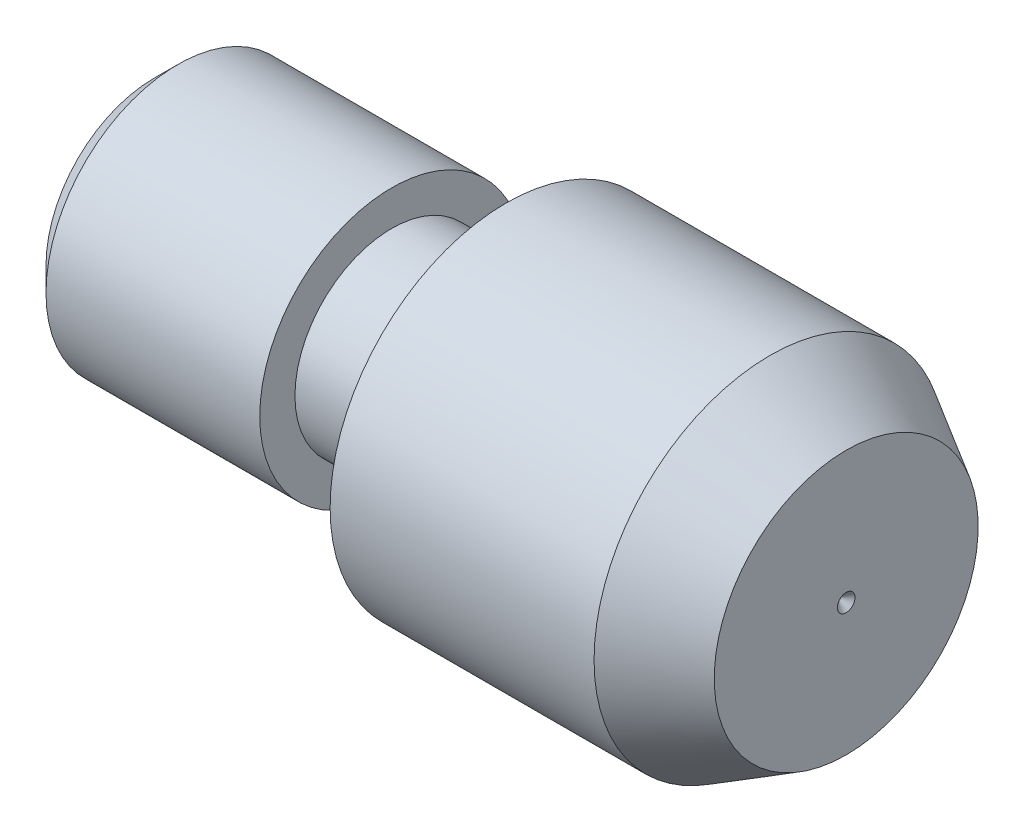
ISO-10303-21;
HEADER;
FILE_DESCRIPTION(('STEP AP214'),'2;1');
FILE_NAME('part.step','',(''),(''),'','','');
FILE_SCHEMA(('AUTOMOTIVE_DESIGN { 1 0 10303 214 1 1 1 1 }'));
ENDSEC;
DATA;
#1=APPLICATION_CONTEXT('core data for automotive mechanical design processes');
#2=APPLICATION_PROTOCOL_DEFINITION('international standard','automotive_design',2000,#1);
#3=PRODUCT_CONTEXT('',#1,'mechanical');
#4=PRODUCT('Part','Part','',(#3));
#5=PRODUCT_RELATED_PRODUCT_CATEGORY('part','',(#4));
#6=PRODUCT_DEFINITION_FORMATION('','',#4);
#7=PRODUCT_DEFINITION_CONTEXT('part definition',#1,'design');
#8=PRODUCT_DEFINITION('design','',#6,#7);
#9=PRODUCT_DEFINITION_SHAPE('','',#8);
#10=(LENGTH_UNIT() NAMED_UNIT(*) SI_UNIT(.MILLI.,.METRE.));
#11=(NAMED_UNIT(*) PLANE_ANGLE_UNIT() SI_UNIT($,.RADIAN.));
#12=(NAMED_UNIT(*) SI_UNIT($,.STERADIAN.) SOLID_ANGLE_UNIT());
#13=UNCERTAINTY_MEASURE_WITH_UNIT(LENGTH_MEASURE(1.E-05),#10,'distance_accuracy_value','');
#14=(GEOMETRIC_REPRESENTATION_CONTEXT(3) GLOBAL_UNCERTAINTY_ASSIGNED_CONTEXT((#13)) GLOBAL_UNIT_ASSIGNED_CONTEXT((#10,
#11,#12)) REPRESENTATION_CONTEXT('',''));
#15=CARTESIAN_POINT('',(0.,0.,0.));
#16=DIRECTION('',(0.,0.,1.));
#17=DIRECTION('',(1.,0.,0.));
#18=AXIS2_PLACEMENT_3D('',#15,#16,#17);
#19=CARTESIAN_POINT('',(7.86602540378444,0.,0.));
#20=DIRECTION('',(-1.,0.,0.));
#21=DIRECTION('',(0.,-1.,0.));
#22=AXIS2_PLACEMENT_3D('',#19,#20,#21);
#23=PLANE('',#22);
#24=CARTESIAN_POINT('',(7.86602540378444,0.,0.));
#25=DIRECTION('',(-1.,0.,0.));
#26=DIRECTION('',(0.,-1.,0.));
#27=AXIS2_PLACEMENT_3D('',#24,#25,#26);
#28=CIRCLE('',#27,1.5);
#29=CARTESIAN_POINT('',(7.86602540378444,-1.5,0.));
#30=VERTEX_POINT('',#29);
#31=EDGE_CURVE('E55',#30,#30,#28,.T.);
#32=ORIENTED_EDGE('',*,*,#31,.F.);
#33=EDGE_LOOP('',(#32));
#34=FACE_BOUND('',#33,.T.);
#35=CARTESIAN_POINT('',(7.86602540378444,0.,0.));
#36=DIRECTION('',(-1.,0.,0.));
#37=DIRECTION('',(0.,-1.,0.));
#38=AXIS2_PLACEMENT_3D('',#35,#36,#37);
#39=CIRCLE('',#38,0.1);
#40=CARTESIAN_POINT('',(7.86602540378444,-0.100000000000001,0.));
#41=VERTEX_POINT('',#40);
#42=EDGE_CURVE('E53',#41,#41,#39,.T.);
#43=ORIENTED_EDGE('',*,*,#42,.T.);
#44=EDGE_LOOP('',(#43));
#45=FACE_BOUND('',#44,.T.);
#46=ADVANCED_FACE('F36',(#34,#45),#23,.F.);
#47=CARTESIAN_POINT('',(3.8,0.,0.));
#48=DIRECTION('',(-1.,0.,0.));
#49=DIRECTION('',(0.,0.,1.));
#50=AXIS2_PLACEMENT_3D('',#47,#48,#49);
#51=TOROIDAL_SURFACE('',#50,1.3,0.2);
#52=CARTESIAN_POINT('',(3.8,0.,0.));
#53=DIRECTION('',(-1.,0.,0.));
#54=DIRECTION('',(0.,0.,1.));
#55=AXIS2_PLACEMENT_3D('',#52,#53,#54);
#56=CIRCLE('',#55,1.1);
#57=CARTESIAN_POINT('',(3.8,0.,1.1));
#58=VERTEX_POINT('',#57);
#59=EDGE_CURVE('E75',#58,#58,#56,.T.);
#60=ORIENTED_EDGE('',*,*,#59,.F.);
#61=EDGE_LOOP('',(#60));
#62=FACE_BOUND('',#61,.T.);
#63=CARTESIAN_POINT('',(4.,0.,0.));
#64=DIRECTION('',(-1.,0.,0.));
#65=DIRECTION('',(0.,0.,1.));
#66=AXIS2_PLACEMENT_3D('',#63,#64,#65);
#67=CIRCLE('',#66,1.3);
#68=CARTESIAN_POINT('',(4.,0.,1.3));
#69=VERTEX_POINT('',#68);
#70=EDGE_CURVE('E63',#69,#69,#67,.T.);
#71=ORIENTED_EDGE('',*,*,#70,.T.);
#72=EDGE_LOOP('',(#71));
#73=FACE_BOUND('',#72,.T.);
#74=ADVANCED_FACE('F96',(#62,#73),#51,.F.);
#75=CARTESIAN_POINT('',(0.,0.,0.));
#76=DIRECTION('',(-1.,0.,0.));
#77=DIRECTION('',(0.,0.,1.));
#78=AXIS2_PLACEMENT_3D('',#75,#76,#77);
#79=CYLINDRICAL_SURFACE('',#78,1.1);
#80=CARTESIAN_POINT('',(2.7,0.,0.));
#81=DIRECTION('',(-1.,0.,0.));
#82=DIRECTION('',(0.,0.,1.));
#83=AXIS2_PLACEMENT_3D('',#80,#81,#82);
#84=CIRCLE('',#83,1.1);
#85=CARTESIAN_POINT('',(2.7,0.,1.1));
#86=VERTEX_POINT('',#85);
#87=EDGE_CURVE('E72',#86,#86,#84,.T.);
#88=ORIENTED_EDGE('',*,*,#87,.F.);
#89=EDGE_LOOP('',(#88));
#90=FACE_BOUND('',#89,.T.);
#91=ORIENTED_EDGE('',*,*,#59,.T.);
#92=EDGE_LOOP('',(#91));
#93=FACE_BOUND('',#92,.T.);
#94=ADVANCED_FACE('F102',(#90,#93),#79,.T.);
#95=CARTESIAN_POINT('',(2.7,1.5,0.));
#96=DIRECTION('',(-1.,0.,0.));
#97=DIRECTION('',(0.,0.,1.));
#98=AXIS2_PLACEMENT_3D('',#95,#96,#97);
#99=PLANE('',#98);
#100=CARTESIAN_POINT('',(2.7,0.,0.));
#101=DIRECTION('',(-1.,0.,0.));
#102=DIRECTION('',(0.,0.,1.));
#103=AXIS2_PLACEMENT_3D('',#100,#101,#102);
#104=CIRCLE('',#103,1.5);
#105=CARTESIAN_POINT('',(2.7,0.,1.5));
#106=VERTEX_POINT('',#105);
#107=EDGE_CURVE('E69',#106,#106,#104,.T.);
#108=ORIENTED_EDGE('',*,*,#107,.F.);
#109=EDGE_LOOP('',(#108));
#110=FACE_BOUND('',#109,.T.);
#111=ORIENTED_EDGE('',*,*,#87,.T.);
#112=EDGE_LOOP('',(#111));
#113=FACE_BOUND('',#112,.T.);
#114=ADVANCED_FACE('F114',(#110,#113),#99,.F.);
#115=CARTESIAN_POINT('',(0.,0.,0.));
#116=DIRECTION('',(-1.,0.,0.));
#117=DIRECTION('',(0.,0.,1.));
#118=AXIS2_PLACEMENT_3D('',#115,#116,#117);
#119=CYLINDRICAL_SURFACE('',#118,1.5);
#120=CARTESIAN_POINT('',(0.270499999999998,0.,0.));
#121=DIRECTION('',(1.,0.,0.));
#122=DIRECTION('',(0.,0.,-1.));
#123=AXIS2_PLACEMENT_3D('',#120,#121,#122);
#124=CIRCLE('',#123,1.5);
#125=CARTESIAN_POINT('',(0.270499999999998,0.,-1.5));
#126=VERTEX_POINT('',#125);
#127=EDGE_CURVE('E11',#126,#126,#124,.T.);
#128=ORIENTED_EDGE('',*,*,#127,.T.);
#129=EDGE_LOOP('',(#128));
#130=FACE_BOUND('',#129,.T.);
#131=ORIENTED_EDGE('',*,*,#107,.T.);
#132=EDGE_LOOP('',(#131));
#133=FACE_BOUND('',#132,.T.);
#134=ADVANCED_FACE('F111',(#130,#133),#119,.T.);
#135=CARTESIAN_POINT('',(0.,0.,0.));
#136=DIRECTION('',(1.,0.,0.));
#137=DIRECTION('',(0.,0.,-1.));
#138=AXIS2_PLACEMENT_3D('',#135,#136,#137);
#139=PLANE('',#138);
#140=CARTESIAN_POINT('',(0.,0.,0.));
#141=DIRECTION('',(1.,0.,0.));
#142=DIRECTION('',(0.,0.,-1.));
#143=AXIS2_PLACEMENT_3D('',#140,#141,#142);
#144=CIRCLE('',#143,1.2295);
#145=CARTESIAN_POINT('',(0.,0.,-1.2295));
#146=VERTEX_POINT('',#145);
#147=EDGE_CURVE('E43',#146,#146,#144,.F.);
#148=ORIENTED_EDGE('',*,*,#147,.T.);
#149=EDGE_LOOP('',(#148));
#150=FACE_BOUND('',#149,.T.);
#151=ADVANCED_FACE('F80',(#150),#139,.F.);
#152=CARTESIAN_POINT('',(0.,0.,0.));
#153=DIRECTION('',(-1.,0.,0.));
#154=DIRECTION('',(0.,0.,1.));
#155=AXIS2_PLACEMENT_3D('',#152,#153,#154);
#156=CYLINDRICAL_SURFACE('',#155,2.);
#157=CARTESIAN_POINT('',(4.,0.,0.));
#158=DIRECTION('',(-1.,0.,0.));
#159=DIRECTION('',(0.,0.,1.));
#160=AXIS2_PLACEMENT_3D('',#157,#158,#159);
#161=CIRCLE('',#160,2.);
#162=CARTESIAN_POINT('',(4.,0.,2.));
#163=VERTEX_POINT('',#162);
#164=EDGE_CURVE('E66',#163,#163,#161,.T.);
#165=ORIENTED_EDGE('',*,*,#164,.F.);
#166=EDGE_LOOP('',(#165));
#167=FACE_BOUND('',#166,.T.);
#168=CARTESIAN_POINT('',(7.,0.,0.));
#169=DIRECTION('',(-1.,0.,0.));
#170=DIRECTION('',(0.,-1.,0.));
#171=AXIS2_PLACEMENT_3D('',#168,#169,#170);
#172=CIRCLE('',#171,2.);
#173=CARTESIAN_POINT('',(7.,-2.,0.));
#174=VERTEX_POINT('',#173);
#175=EDGE_CURVE('E58',#174,#174,#172,.T.);
#176=ORIENTED_EDGE('',*,*,#175,.T.);
#177=EDGE_LOOP('',(#176));
#178=FACE_BOUND('',#177,.T.);
#179=ADVANCED_FACE('F91',(#167,#178),#156,.T.);
#180=CARTESIAN_POINT('',(4.,1.3,0.));
#181=DIRECTION('',(1.,0.,0.));
#182=DIRECTION('',(0.,0.,-1.));
#183=AXIS2_PLACEMENT_3D('',#180,#181,#182);
#184=PLANE('',#183);
#185=ORIENTED_EDGE('',*,*,#70,.F.);
#186=EDGE_LOOP('',(#185));
#187=FACE_BOUND('',#186,.T.);
#188=ORIENTED_EDGE('',*,*,#164,.T.);
#189=EDGE_LOOP('',(#188));
#190=FACE_BOUND('',#189,.T.);
#191=ADVANCED_FACE('F83',(#187,#190),#184,.F.);
#192=CARTESIAN_POINT('',(0.,0.,0.));
#193=DIRECTION('',(1.,0.,0.));
#194=DIRECTION('',(0.,0.,-1.));
#195=AXIS2_PLACEMENT_3D('',#192,#193,#194);
#196=CONICAL_SURFACE('',#195,1.2295,0.785398163397448);
#197=ORIENTED_EDGE('',*,*,#127,.F.);
#198=EDGE_LOOP('',(#197));
#199=FACE_BOUND('',#198,.T.);
#200=ORIENTED_EDGE('',*,*,#147,.F.);
#201=EDGE_LOOP('',(#200));
#202=FACE_BOUND('',#201,.T.);
#203=ADVANCED_FACE('F38',(#199,#202),#196,.T.);
#204=CARTESIAN_POINT('',(7.86602540378444,0.,0.));
#205=DIRECTION('',(-1.,0.,0.));
#206=DIRECTION('',(0.,-1.,0.));
#207=AXIS2_PLACEMENT_3D('',#204,#205,#206);
#208=CONICAL_SURFACE('',#207,1.5,0.5235987755983);
#209=ORIENTED_EDGE('',*,*,#175,.F.);
#210=EDGE_LOOP('',(#209));
#211=FACE_BOUND('',#210,.T.);
#212=ORIENTED_EDGE('',*,*,#31,.T.);
#213=EDGE_LOOP('',(#212));
#214=FACE_BOUND('',#213,.T.);
#215=ADVANCED_FACE('F49',(#211,#214),#208,.T.);
#216=CARTESIAN_POINT('',(7.86602540378444,0.,0.));
#217=DIRECTION('',(1.,0.,0.));
#218=DIRECTION('',(0.,1.,0.));
#219=AXIS2_PLACEMENT_3D('',#216,#217,#218);
#220=CONICAL_SURFACE('',#219,0.1,0.785398163397443);
#221=CARTESIAN_POINT('',(7.76602540378444,0.,0.));
#222=VERTEX_POINT('',#221);
#223=VERTEX_LOOP('',#222);
#224=FACE_BOUND('',#223,.T.);
#225=ORIENTED_EDGE('',*,*,#42,.F.);
#226=EDGE_LOOP('',(#225));
#227=FACE_BOUND('',#226,.T.);
#228=ADVANCED_FACE('F46',(#224,#227),#220,.F.);
#229=CLOSED_SHELL('',(#46,#74,#94,#114,#134,#151,#179,#191,#203,#215,#228));
#230=MANIFOLD_SOLID_BREP('B2',#229);
#231=ADVANCED_BREP_SHAPE_REPRESENTATION('',(#18,#230),#14);
#232=SHAPE_DEFINITION_REPRESENTATION(#9,#231);
ENDSEC;
END-ISO-10303-21;
